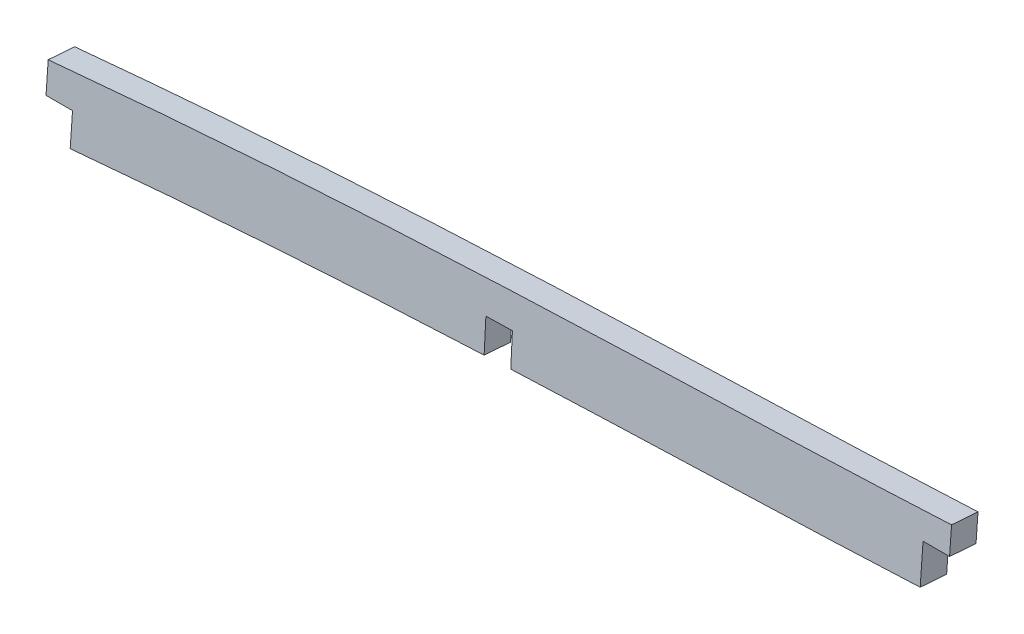
ISO-10303-21;
HEADER;
FILE_DESCRIPTION(('STEP AP214'),'2;1');
FILE_NAME('part.step','',(''),(''),'','','');
FILE_SCHEMA(('AUTOMOTIVE_DESIGN { 1 0 10303 214 1 1 1 1 }'));
ENDSEC;
DATA;
#1=APPLICATION_CONTEXT('core data for automotive mechanical design processes');
#2=APPLICATION_PROTOCOL_DEFINITION('international standard','automotive_design',2000,#1);
#3=PRODUCT_CONTEXT('',#1,'mechanical');
#4=PRODUCT('Part','Part','',(#3));
#5=PRODUCT_RELATED_PRODUCT_CATEGORY('part','',(#4));
#6=PRODUCT_DEFINITION_FORMATION('','',#4);
#7=PRODUCT_DEFINITION_CONTEXT('part definition',#1,'design');
#8=PRODUCT_DEFINITION('design','',#6,#7);
#9=PRODUCT_DEFINITION_SHAPE('','',#8);
#10=(LENGTH_UNIT() NAMED_UNIT(*) SI_UNIT(.MILLI.,.METRE.));
#11=(NAMED_UNIT(*) PLANE_ANGLE_UNIT() SI_UNIT($,.RADIAN.));
#12=(NAMED_UNIT(*) SI_UNIT($,.STERADIAN.) SOLID_ANGLE_UNIT());
#13=UNCERTAINTY_MEASURE_WITH_UNIT(LENGTH_MEASURE(1.E-05),#10,'distance_accuracy_value','');
#14=(GEOMETRIC_REPRESENTATION_CONTEXT(3) GLOBAL_UNCERTAINTY_ASSIGNED_CONTEXT((#13)) GLOBAL_UNIT_ASSIGNED_CONTEXT((#10,
#11,#12)) REPRESENTATION_CONTEXT('',''));
#15=CARTESIAN_POINT('',(0.,0.,0.));
#16=DIRECTION('',(0.,0.,1.));
#17=DIRECTION('',(1.,0.,0.));
#18=AXIS2_PLACEMENT_3D('',#15,#16,#17);
#19=CARTESIAN_POINT('',(267.381419678439,55.3505429301001,-414.969986035978));
#20=CARTESIAN_POINT('',(276.266785963751,56.1449921604025,-415.028990629957));
#21=CARTESIAN_POINT('',(294.055430197414,57.505145214769,-415.130010651954));
#22=CARTESIAN_POINT('',(320.802569684627,58.859506618774,-415.230600521886));
#23=CARTESIAN_POINT('',(343.188421351292,59.5830465900964,-415.284338609364));
#24=CARTESIAN_POINT('',(361.20065040251,60.1721262466564,-415.328090185463));
#25=CARTESIAN_POINT('',(370.250673033949,60.5520193136477,-415.356305249835));
#26=CARTESIAN_POINT('',(374.768324065404,60.7720389265057,-415.372646341787));
#27=B_SPLINE_CURVE_WITH_KNOTS('',3,(#19,#20,#21,#22,#23,#24,#25,#26),.UNSPECIFIED.,.F.,.F.,(4,1,
1,1,1,4),(0.,0.25,0.5,0.75,0.875,1.),.UNSPECIFIED.);
#28=DIRECTION('',(0.,0.0740670663478944,0.997253262558021));
#29=VECTOR('',#28,1.);
#30=SURFACE_OF_LINEAR_EXTRUSION('',#27,#29);
#31=DIRECTION('',(0.,0.0740670663478944,0.997253262558021));
#32=VECTOR('',#31,1.);
#33=CARTESIAN_POINT('',(319.180386609188,58.8622179418261,-413.163303569819));
#34=LINE('',#33,#32);
#35=CARTESIAN_POINT('',(319.180386609188,58.9446679594898,-412.053180634385));
#36=VERTEX_POINT('',#35);
#37=CARTESIAN_POINT('',(319.180386609187,58.7095050238392,-415.219459742954));
#38=VERTEX_POINT('',#37);
#39=EDGE_CURVE('E267',#36,#38,#34,.F.);
#40=ORIENTED_EDGE('',*,*,#39,.F.);
#41=CARTESIAN_POINT('',(267.381419678439,55.5857058657546,-411.803706927357));
#42=CARTESIAN_POINT('',(276.266785963751,56.380155096057,-411.862711521335));
#43=CARTESIAN_POINT('',(294.055430197414,57.7403081504236,-411.963731543333));
#44=CARTESIAN_POINT('',(320.802569684627,59.0946695544286,-412.064321413264));
#45=CARTESIAN_POINT('',(343.188421351292,59.818209525751,-412.118059500743));
#46=CARTESIAN_POINT('',(361.20065040251,60.407289182311,-412.161811076841));
#47=CARTESIAN_POINT('',(370.250673033949,60.7871822493023,-412.190026141213));
#48=CARTESIAN_POINT('',(374.768324065404,61.0072018621602,-412.206367233166));
#49=B_SPLINE_CURVE_WITH_KNOTS('',3,(#41,#42,#43,#44,#45,#46,#47,#48),.UNSPECIFIED.,.F.,.F.,(4,1,
1,1,1,4),(0.,0.25,0.5,0.75,0.875,1.),.UNSPECIFIED.);
#50=CARTESIAN_POINT('',(269.875,55.8056361810018,-411.82004138708));
#51=VERTEX_POINT('',#50);
#52=EDGE_CURVE('E160',#51,#36,#49,.T.);
#53=ORIENTED_EDGE('',*,*,#52,.F.);
#54=DIRECTION('',(0.,0.0740670663478944,0.997253262558021));
#55=VECTOR('',#54,1.);
#56=CARTESIAN_POINT('',(269.875,55.5704732453472,-414.986320495702));
#57=LINE('',#56,#55);
#58=CARTESIAN_POINT('',(269.875,55.5704732453472,-414.986320495702));
#59=VERTEX_POINT('',#58);
#60=EDGE_CURVE('E174',#59,#51,#57,.T.);
#61=ORIENTED_EDGE('',*,*,#60,.F.);
#62=EDGE_CURVE('E142',#59,#38,#27,.T.);
#63=ORIENTED_EDGE('',*,*,#62,.T.);
#64=EDGE_LOOP('',(#40,#53,#61,#63));
#65=FACE_BOUND('',#64,.T.);
#66=ADVANCED_FACE('F33',(#65),#30,.T.);
#67=CARTESIAN_POINT('',(374.396000000001,68.3733100676446,-415.937200878811));
#68=CARTESIAN_POINT('',(369.906968565399,68.1546047890361,-415.920957403869));
#69=CARTESIAN_POINT('',(365.416811664589,67.9659702223396,-415.90694731286));
#70=CARTESIAN_POINT('',(356.434934477744,67.6304723178948,-415.882029524691));
#71=CARTESIAN_POINT('',(351.943241867214,67.4828695335936,-415.871066908043));
#72=CARTESIAN_POINT('',(342.959728051043,67.191099826946,-415.84939685989));
#73=CARTESIAN_POINT('',(338.46791231829,67.0467866775179,-415.838678567943));
#74=CARTESIAN_POINT('',(329.485142554435,66.7351370467292,-415.815532016562));
#75=CARTESIAN_POINT('',(324.994172696955,66.5678564838284,-415.803107910253));
#76=CARTESIAN_POINT('',(311.523515084952,66.008070181035,-415.761531982867));
#77=CARTESIAN_POINT('',(302.548294735156,65.5543942384513,-415.727836985416));
#78=CARTESIAN_POINT('',(284.612946057081,64.4142579684823,-415.643157845298));
#79=CARTESIAN_POINT('',(275.652726317957,63.7292075925199,-415.592278421231));
#80=CARTESIAN_POINT('',(266.7,62.9285761835817,-415.532814670234));
#81=B_SPLINE_CURVE_WITH_KNOTS('',3,(#67,#68,#69,#70,#71,#72,#73,#74,#75,#76,#77,#78,#79,#80),
.UNSPECIFIED.,.F.,.F.,(4,2,2,2,2,2,4),(0.,0.125,0.25,0.375,0.5,0.75,1.),.UNSPECIFIED.);
#82=DIRECTION('',(0.,0.0740670663478944,0.997253262558021));
#83=VECTOR('',#82,1.);
#84=SURFACE_OF_LINEAR_EXTRUSION('',#81,#83);
#85=CARTESIAN_POINT('',(266.7,63.1637391192362,-412.366535561612));
#86=CARTESIAN_POINT('',(275.652726317957,63.9643705281745,-412.425999312609));
#87=CARTESIAN_POINT('',(284.612946057081,64.6494209041368,-412.476878736676));
#88=CARTESIAN_POINT('',(302.548294735156,65.7895571741059,-412.561557876794));
#89=CARTESIAN_POINT('',(311.523515084952,66.2432331166896,-412.595252874245));
#90=CARTESIAN_POINT('',(324.994172696955,66.8030194194829,-412.636828801632));
#91=CARTESIAN_POINT('',(329.485142554435,66.9702999823837,-412.649252907941));
#92=CARTESIAN_POINT('',(338.46791231829,67.2819496131725,-412.672399459321));
#93=CARTESIAN_POINT('',(342.959728051043,67.4262627626006,-412.683117751268));
#94=CARTESIAN_POINT('',(351.943241867214,67.7180324692482,-412.704787799421));
#95=CARTESIAN_POINT('',(356.434934477744,67.8656352535493,-412.715750416069));
#96=CARTESIAN_POINT('',(365.416811664589,68.2011331579942,-412.740668204239));
#97=CARTESIAN_POINT('',(369.906968565399,68.3897677246907,-412.754678295247));
#98=CARTESIAN_POINT('',(374.396000000001,68.6084730032992,-412.770921770189));
#99=B_SPLINE_CURVE_WITH_KNOTS('',3,(#85,#86,#87,#88,#89,#90,#91,#92,#93,#94,#95,#96,#97,#98),
.UNSPECIFIED.,.F.,.F.,(4,2,2,2,2,2,4),(0.,0.25,0.5,0.625,0.75,0.875,1.),.UNSPECIFIED.);
#100=CARTESIAN_POINT('',(374.396000000001,68.6084730032992,-412.770921770189));
#101=VERTEX_POINT('',#100);
#102=CARTESIAN_POINT('',(266.7,63.1637391192362,-412.366535561612));
#103=VERTEX_POINT('',#102);
#104=EDGE_CURVE('E228',#101,#103,#99,.F.);
#105=ORIENTED_EDGE('',*,*,#104,.F.);
#106=DIRECTION('',(0.,0.0740670663478944,0.997253262558021));
#107=VECTOR('',#106,1.);
#108=CARTESIAN_POINT('',(374.396000000001,68.3733100676446,-415.937200878811));
#109=LINE('',#108,#107);
#110=CARTESIAN_POINT('',(374.396000000001,68.3733100676446,-415.937200878811));
#111=VERTEX_POINT('',#110);
#112=EDGE_CURVE('E59',#111,#101,#109,.T.);
#113=ORIENTED_EDGE('',*,*,#112,.F.);
#114=CARTESIAN_POINT('',(374.396000000001,68.3733100676446,-415.937200878811));
#115=CARTESIAN_POINT('',(369.906968565399,68.1546047890361,-415.920957403869));
#116=CARTESIAN_POINT('',(365.416811664589,67.9659702223396,-415.90694731286));
#117=CARTESIAN_POINT('',(356.434934477744,67.6304723178948,-415.882029524691));
#118=CARTESIAN_POINT('',(351.943241867214,67.4828695335936,-415.871066908043));
#119=CARTESIAN_POINT('',(342.959728051043,67.191099826946,-415.84939685989));
#120=CARTESIAN_POINT('',(338.46791231829,67.0467866775179,-415.838678567943));
#121=CARTESIAN_POINT('',(329.485142554435,66.7351370467292,-415.815532016562));
#122=CARTESIAN_POINT('',(324.994172696955,66.5678564838284,-415.803107910253));
#123=CARTESIAN_POINT('',(311.523515084952,66.008070181035,-415.761531982867));
#124=CARTESIAN_POINT('',(302.548294735156,65.5543942384513,-415.727836985416));
#125=CARTESIAN_POINT('',(284.612946057081,64.4142579684823,-415.643157845298));
#126=CARTESIAN_POINT('',(275.652726317957,63.7292075925199,-415.592278421231));
#127=CARTESIAN_POINT('',(266.7,62.9285761835817,-415.532814670234));
#128=B_SPLINE_CURVE_WITH_KNOTS('',3,(#114,#115,#116,#117,#118,#119,#120,#121,#122,#123,#124,
#125,#126,#127),.UNSPECIFIED.,.F.,.F.,(4,2,2,2,2,2,4),(0.,0.125,0.25,0.375,0.5,0.75,1.),.UNSPECIFIED.);
#129=CARTESIAN_POINT('',(266.7,62.9285761835817,-415.532814670234));
#130=VERTEX_POINT('',#129);
#131=EDGE_CURVE('E181',#111,#130,#128,.T.);
#132=ORIENTED_EDGE('',*,*,#131,.T.);
#133=DIRECTION('',(0.,0.0740670663478944,0.997253262558021));
#134=VECTOR('',#133,1.);
#135=CARTESIAN_POINT('',(266.7,62.9285761835817,-415.532814670234));
#136=LINE('',#135,#134);
#137=EDGE_CURVE('E98',#130,#103,#136,.T.);
#138=ORIENTED_EDGE('',*,*,#137,.T.);
#139=EDGE_LOOP('',(#105,#113,#132,#138));
#140=FACE_BOUND('',#139,.T.);
#141=ADVANCED_FACE('F35',(#140),#84,.T.);
#142=CARTESIAN_POINT('',(374.396000000001,65.2070487620994,-415.70203926541));
#143=DIRECTION('',(1.,0.,0.));
#144=DIRECTION('',(0.,0.,-1.));
#145=AXIS2_PLACEMENT_3D('',#142,#143,#144);
#146=PLANE('',#145);
#147=DIRECTION('',(0.,0.997253262558021,-0.0740670663478956));
#148=VECTOR('',#147,1.);
#149=CARTESIAN_POINT('',(374.396000000001,65.442211697754,-412.535760156788));
#150=LINE('',#149,#148);
#151=CARTESIAN_POINT('',(374.396000000001,65.442211697754,-412.535760156788));
#152=VERTEX_POINT('',#151);
#153=EDGE_CURVE('E171',#152,#101,#150,.T.);
#154=ORIENTED_EDGE('',*,*,#153,.F.);
#155=DIRECTION('',(0.,0.0740670663478944,0.997253262558021));
#156=VECTOR('',#155,1.);
#157=CARTESIAN_POINT('',(374.396000000001,65.2070487620994,-415.70203926541));
#158=LINE('',#157,#156);
#159=CARTESIAN_POINT('',(374.396000000001,65.2070487620994,-415.70203926541));
#160=VERTEX_POINT('',#159);
#161=EDGE_CURVE('E128',#160,#152,#158,.T.);
#162=ORIENTED_EDGE('',*,*,#161,.F.);
#163=DIRECTION('',(0.,0.997253262558021,-0.0740670663478956));
#164=VECTOR('',#163,1.);
#165=CARTESIAN_POINT('',(374.396000000001,65.2070487620994,-415.70203926541));
#166=LINE('',#165,#164);
#167=EDGE_CURVE('E137',#160,#111,#166,.T.);
#168=ORIENTED_EDGE('',*,*,#167,.T.);
#169=ORIENTED_EDGE('',*,*,#112,.T.);
#170=EDGE_LOOP('',(#154,#162,#168,#169));
#171=FACE_BOUND('',#170,.T.);
#172=ADVANCED_FACE('F213',(#171),#146,.T.);
#173=CARTESIAN_POINT('',(371.221000000001,65.2070487620994,-415.70203926541));
#174=DIRECTION('',(0.,-0.997253262558021,0.0740670663478944));
#175=DIRECTION('',(0.,-0.0740670663478944,-0.997253262558021));
#176=AXIS2_PLACEMENT_3D('',#173,#174,#175);
#177=PLANE('',#176);
#178=DIRECTION('',(1.,0.,0.));
#179=VECTOR('',#178,1.);
#180=CARTESIAN_POINT('',(371.221000000001,65.442211697754,-412.535760156788));
#181=LINE('',#180,#179);
#182=CARTESIAN_POINT('',(371.221000000001,65.442211697754,-412.535760156788));
#183=VERTEX_POINT('',#182);
#184=EDGE_CURVE('E123',#183,#152,#181,.T.);
#185=ORIENTED_EDGE('',*,*,#184,.F.);
#186=DIRECTION('',(0.,0.0740670663478944,0.997253262558021));
#187=VECTOR('',#186,1.);
#188=CARTESIAN_POINT('',(371.221000000001,65.2070487620994,-415.70203926541));
#189=LINE('',#188,#187);
#190=CARTESIAN_POINT('',(371.221000000001,65.2070487620994,-415.70203926541));
#191=VERTEX_POINT('',#190);
#192=EDGE_CURVE('E117',#191,#183,#189,.T.);
#193=ORIENTED_EDGE('',*,*,#192,.F.);
#194=DIRECTION('',(1.,0.,0.));
#195=VECTOR('',#194,1.);
#196=CARTESIAN_POINT('',(371.221000000001,65.2070487620994,-415.70203926541));
#197=LINE('',#196,#195);
#198=EDGE_CURVE('E120',#191,#160,#197,.T.);
#199=ORIENTED_EDGE('',*,*,#198,.T.);
#200=ORIENTED_EDGE('',*,*,#161,.T.);
#201=EDGE_LOOP('',(#185,#193,#199,#200));
#202=FACE_BOUND('',#201,.T.);
#203=ADVANCED_FACE('F119',(#202),#177,.T.);
#204=CARTESIAN_POINT('',(371.221000000001,65.2070487620994,-415.70203926541));
#205=DIRECTION('',(1.,0.,0.));
#206=DIRECTION('',(0.,1.,0.));
#207=AXIS2_PLACEMENT_3D('',#204,#205,#206);
#208=PLANE('',#207);
#209=DIRECTION('',(0.,0.997253262558021,-0.0740670663478947));
#210=VECTOR('',#209,1.);
#211=CARTESIAN_POINT('',(371.221000000001,65.442211697754,-412.535760156788));
#212=LINE('',#211,#210);
#213=CARTESIAN_POINT('',(371.221000000001,60.8405169930736,-412.193987369673));
#214=VERTEX_POINT('',#213);
#215=EDGE_CURVE('E165',#214,#183,#212,.T.);
#216=ORIENTED_EDGE('',*,*,#215,.F.);
#217=DIRECTION('',(0.,0.0740670663478944,0.997253262558021));
#218=VECTOR('',#217,1.);
#219=CARTESIAN_POINT('',(371.221000000001,60.605354057419,-415.360266478295));
#220=LINE('',#219,#218);
#221=CARTESIAN_POINT('',(371.221000000001,60.605354057419,-415.360266478295));
#222=VERTEX_POINT('',#221);
#223=EDGE_CURVE('E129',#222,#214,#220,.T.);
#224=ORIENTED_EDGE('',*,*,#223,.F.);
#225=DIRECTION('',(0.,0.997253262558021,-0.0740670663478947));
#226=VECTOR('',#225,1.);
#227=CARTESIAN_POINT('',(371.221000000001,65.2070487620994,-415.70203926541));
#228=LINE('',#227,#226);
#229=EDGE_CURVE('E136',#222,#191,#228,.T.);
#230=ORIENTED_EDGE('',*,*,#229,.T.);
#231=ORIENTED_EDGE('',*,*,#192,.T.);
#232=EDGE_LOOP('',(#216,#224,#230,#231));
#233=FACE_BOUND('',#232,.T.);
#234=ADVANCED_FACE('F140',(#233),#208,.T.);
#235=DIRECTION('',(0.,0.0740670663478944,0.997253262558021));
#236=VECTOR('',#235,1.);
#237=CARTESIAN_POINT('',(322.353349484499,58.9939078626532,-413.173084321078));
#238=LINE('',#237,#236);
#239=CARTESIAN_POINT('',(322.353349484499,59.0763578803169,-412.062961385644));
#240=VERTEX_POINT('',#239);
#241=CARTESIAN_POINT('',(322.353349484499,58.8411949446663,-415.229240494213));
#242=VERTEX_POINT('',#241);
#243=EDGE_CURVE('E50',#240,#242,#238,.F.);
#244=ORIENTED_EDGE('',*,*,#243,.T.);
#245=EDGE_CURVE('E145',#242,#222,#27,.T.);
#246=ORIENTED_EDGE('',*,*,#245,.T.);
#247=ORIENTED_EDGE('',*,*,#223,.T.);
#248=EDGE_CURVE('E159',#240,#214,#49,.T.);
#249=ORIENTED_EDGE('',*,*,#248,.F.);
#250=EDGE_LOOP('',(#244,#246,#247,#249));
#251=FACE_BOUND('',#250,.T.);
#252=ADVANCED_FACE('F292',(#251),#30,.T.);
#253=CARTESIAN_POINT('',(269.875,59.3700081756932,-415.268516018487));
#254=DIRECTION('',(-1.,0.,0.));
#255=DIRECTION('',(0.,-1.,0.));
#256=AXIS2_PLACEMENT_3D('',#253,#254,#255);
#257=PLANE('',#256);
#258=DIRECTION('',(0.,-0.997253262558021,0.0740670663478924));
#259=VECTOR('',#258,1.);
#260=CARTESIAN_POINT('',(269.875,59.6051711113478,-412.102236909865));
#261=LINE('',#260,#259);
#262=CARTESIAN_POINT('',(269.875,59.6051711113478,-412.102236909865));
#263=VERTEX_POINT('',#262);
#264=EDGE_CURVE('E155',#263,#51,#261,.T.);
#265=ORIENTED_EDGE('',*,*,#264,.F.);
#266=DIRECTION('',(0.,0.0740670663478944,0.997253262558021));
#267=VECTOR('',#266,1.);
#268=CARTESIAN_POINT('',(269.875,59.3700081756932,-415.268516018487));
#269=LINE('',#268,#267);
#270=CARTESIAN_POINT('',(269.875,59.3700081756932,-415.268516018487));
#271=VERTEX_POINT('',#270);
#272=EDGE_CURVE('E176',#271,#263,#269,.T.);
#273=ORIENTED_EDGE('',*,*,#272,.F.);
#274=DIRECTION('',(0.,-0.997253262558021,0.0740670663478924));
#275=VECTOR('',#274,1.);
#276=CARTESIAN_POINT('',(269.875,59.3700081756932,-415.268516018487));
#277=LINE('',#276,#275);
#278=EDGE_CURVE('E286',#271,#59,#277,.T.);
#279=ORIENTED_EDGE('',*,*,#278,.T.);
#280=ORIENTED_EDGE('',*,*,#60,.T.);
#281=EDGE_LOOP('',(#265,#273,#279,#280));
#282=FACE_BOUND('',#281,.T.);
#283=ADVANCED_FACE('F317',(#282),#257,.T.);
#284=CARTESIAN_POINT('',(266.7,59.3700081756932,-415.268516018487));
#285=DIRECTION('',(0.,-0.997253262558021,0.0740670663478944));
#286=DIRECTION('',(0.,-0.0740670663478944,-0.997253262558021));
#287=AXIS2_PLACEMENT_3D('',#284,#285,#286);
#288=PLANE('',#287);
#289=DIRECTION('',(1.,0.,0.));
#290=VECTOR('',#289,1.);
#291=CARTESIAN_POINT('',(266.7,59.6051711113478,-412.102236909865));
#292=LINE('',#291,#290);
#293=CARTESIAN_POINT('',(266.7,59.6051711113478,-412.102236909865));
#294=VERTEX_POINT('',#293);
#295=EDGE_CURVE('E152',#294,#263,#292,.T.);
#296=ORIENTED_EDGE('',*,*,#295,.F.);
#297=DIRECTION('',(0.,0.0740670663478944,0.997253262558021));
#298=VECTOR('',#297,1.);
#299=CARTESIAN_POINT('',(266.7,59.3700081756932,-415.268516018487));
#300=LINE('',#299,#298);
#301=CARTESIAN_POINT('',(266.7,59.3700081756932,-415.268516018487));
#302=VERTEX_POINT('',#301);
#303=EDGE_CURVE('E178',#302,#294,#300,.T.);
#304=ORIENTED_EDGE('',*,*,#303,.F.);
#305=DIRECTION('',(1.,0.,0.));
#306=VECTOR('',#305,1.);
#307=CARTESIAN_POINT('',(266.7,59.3700081756932,-415.268516018487));
#308=LINE('',#307,#306);
#309=EDGE_CURVE('E281',#302,#271,#308,.T.);
#310=ORIENTED_EDGE('',*,*,#309,.T.);
#311=ORIENTED_EDGE('',*,*,#272,.T.);
#312=EDGE_LOOP('',(#296,#304,#310,#311));
#313=FACE_BOUND('',#312,.T.);
#314=ADVANCED_FACE('F316',(#313),#288,.T.);
#315=CARTESIAN_POINT('',(266.7,62.9285761835817,-415.532814670234));
#316=DIRECTION('',(-1.,0.,0.));
#317=DIRECTION('',(0.,-1.,0.));
#318=AXIS2_PLACEMENT_3D('',#315,#316,#317);
#319=PLANE('',#318);
#320=DIRECTION('',(0.,-0.997253262558021,0.0740670663478917));
#321=VECTOR('',#320,1.);
#322=CARTESIAN_POINT('',(266.7,63.1637391192362,-412.366535561612));
#323=LINE('',#322,#321);
#324=EDGE_CURVE('E156',#103,#294,#323,.T.);
#325=ORIENTED_EDGE('',*,*,#324,.F.);
#326=ORIENTED_EDGE('',*,*,#137,.F.);
#327=DIRECTION('',(0.,-0.997253262558021,0.0740670663478917));
#328=VECTOR('',#327,1.);
#329=CARTESIAN_POINT('',(266.7,62.9285761835817,-415.532814670234));
#330=LINE('',#329,#328);
#331=EDGE_CURVE('E287',#130,#302,#330,.T.);
#332=ORIENTED_EDGE('',*,*,#331,.T.);
#333=ORIENTED_EDGE('',*,*,#303,.T.);
#334=EDGE_LOOP('',(#325,#326,#332,#333));
#335=FACE_BOUND('',#334,.T.);
#336=ADVANCED_FACE('F206',(#335),#319,.T.);
#337=CARTESIAN_POINT('',(320.503953492954,66.3812610495639,-415.789249267791));
#338=DIRECTION('',(0.,0.0740670663479247,0.997253262558018));
#339=DIRECTION('',(0.,-0.997253262558018,0.0740670663479247));
#340=AXIS2_PLACEMENT_3D('',#337,#338,#339);
#341=PLANE('',#340);
#342=DIRECTION('',(0.999787874769594,0.0205396762896743,-0.00152550372475393));
#343=VECTOR('',#342,1.);
#344=CARTESIAN_POINT('',(322.274861127297,62.6407298750125,-415.511436016995));
#345=LINE('',#344,#343);
#346=CARTESIAN_POINT('',(319.100525028198,62.5755162056378,-415.506592528026));
#347=VERTEX_POINT('',#346);
#348=CARTESIAN_POINT('',(322.274861127297,62.6407298750125,-415.511436016995));
#349=VERTEX_POINT('',#348);
#350=EDGE_CURVE('E419',#347,#349,#345,.T.);
#351=ORIENTED_EDGE('',*,*,#350,.F.);
#352=DIRECTION('',(-0.0205962487755898,0.997041719980024,-0.0740513548535765));
#353=VECTOR('',#352,1.);
#354=CARTESIAN_POINT('',(319.100525028198,62.5755162056378,-415.506592528026));
#355=LINE('',#354,#353);
#356=EDGE_CURVE('E266',#38,#347,#355,.T.);
#357=ORIENTED_EDGE('',*,*,#356,.F.);
#358=ORIENTED_EDGE('',*,*,#62,.F.);
#359=ORIENTED_EDGE('',*,*,#278,.F.);
#360=ORIENTED_EDGE('',*,*,#309,.F.);
#361=ORIENTED_EDGE('',*,*,#331,.F.);
#362=ORIENTED_EDGE('',*,*,#131,.F.);
#363=ORIENTED_EDGE('',*,*,#167,.F.);
#364=ORIENTED_EDGE('',*,*,#198,.F.);
#365=ORIENTED_EDGE('',*,*,#229,.F.);
#366=ORIENTED_EDGE('',*,*,#245,.F.);
#367=DIRECTION('',(0.0205962487773723,-0.997041719979988,0.0740513548535614));
#368=VECTOR('',#367,1.);
#369=CARTESIAN_POINT('',(322.274861127297,62.6407298750125,-415.511436016995));
#370=LINE('',#369,#368);
#371=EDGE_CURVE('E297',#349,#242,#370,.T.);
#372=ORIENTED_EDGE('',*,*,#371,.F.);
#373=EDGE_LOOP('',(#351,#357,#358,#359,#360,#361,#362,#363,#364,#365,#366,#372));
#374=FACE_BOUND('',#373,.T.);
#375=ADVANCED_FACE('F134',(#374),#341,.F.);
#376=CARTESIAN_POINT('',(320.503953492954,66.6164239852185,-412.622970159169));
#377=DIRECTION('',(0.,0.0740670663479247,0.997253262558018));
#378=DIRECTION('',(0.,-0.997253262558018,0.0740670663479247));
#379=AXIS2_PLACEMENT_3D('',#376,#377,#378);
#380=PLANE('',#379);
#381=DIRECTION('',(0.0205962487755898,-0.997041719979962,0.0740513548544129));
#382=VECTOR('',#381,1.);
#383=CARTESIAN_POINT('',(319.022537082218,66.5859897158179,-412.620709773432));
#384=LINE('',#383,#382);
#385=CARTESIAN_POINT('',(319.100525028199,62.8106791412856,-412.34031341946));
#386=VERTEX_POINT('',#385);
#387=EDGE_CURVE('E11',#386,#36,#384,.T.);
#388=ORIENTED_EDGE('',*,*,#387,.F.);
#389=DIRECTION('',(-0.999787874769594,-0.0205396762896776,0.00152550372470976));
#390=VECTOR('',#389,1.);
#391=CARTESIAN_POINT('',(320.581941438942,62.8411134106889,-412.342573805198));
#392=LINE('',#391,#390);
#393=CARTESIAN_POINT('',(322.274861127297,62.8758928106603,-412.345156908429));
#394=VERTEX_POINT('',#393);
#395=EDGE_CURVE('E43',#394,#386,#392,.T.);
#396=ORIENTED_EDGE('',*,*,#395,.F.);
#397=DIRECTION('',(-0.0205962487773723,0.997041719979925,-0.0740513548544101));
#398=VECTOR('',#397,1.);
#399=CARTESIAN_POINT('',(322.19687318131,66.65120338519,-412.625553262401));
#400=LINE('',#399,#398);
#401=EDGE_CURVE('E245',#240,#394,#400,.T.);
#402=ORIENTED_EDGE('',*,*,#401,.F.);
#403=ORIENTED_EDGE('',*,*,#248,.T.);
#404=ORIENTED_EDGE('',*,*,#215,.T.);
#405=ORIENTED_EDGE('',*,*,#184,.T.);
#406=ORIENTED_EDGE('',*,*,#153,.T.);
#407=ORIENTED_EDGE('',*,*,#104,.T.);
#408=ORIENTED_EDGE('',*,*,#324,.T.);
#409=ORIENTED_EDGE('',*,*,#295,.T.);
#410=ORIENTED_EDGE('',*,*,#264,.T.);
#411=ORIENTED_EDGE('',*,*,#52,.T.);
#412=EDGE_LOOP('',(#388,#396,#402,#403,#404,#405,#406,#407,#408,#409,#410,#411));
#413=FACE_BOUND('',#412,.T.);
#414=ADVANCED_FACE('F205',(#413),#380,.T.);
#415=CARTESIAN_POINT('',(322.274861127297,62.946155710983,-411.399123670725));
#416=DIRECTION('',(-0.0205962487773586,0.997041719979988,-0.0740513548535667));
#417=DIRECTION('',(0.,0.074067066347081,0.997253262558081));
#418=AXIS2_PLACEMENT_3D('',#415,#416,#417);
#419=PLANE('',#418);
#420=ORIENTED_EDGE('',*,*,#395,.T.);
#421=DIRECTION('',(0.,-0.0740670663470824,-0.997253262558081));
#422=VECTOR('',#421,1.);
#423=CARTESIAN_POINT('',(319.100525028199,62.8809420416083,-411.394280181756));
#424=LINE('',#423,#422);
#425=EDGE_CURVE('E254',#386,#347,#424,.T.);
#426=ORIENTED_EDGE('',*,*,#425,.T.);
#427=ORIENTED_EDGE('',*,*,#350,.T.);
#428=DIRECTION('',(0.,-0.0740670663470824,-0.997253262558081));
#429=VECTOR('',#428,1.);
#430=CARTESIAN_POINT('',(322.274861127297,62.946155710983,-411.399123670725));
#431=LINE('',#430,#429);
#432=EDGE_CURVE('E258',#394,#349,#431,.T.);
#433=ORIENTED_EDGE('',*,*,#432,.F.);
#434=EDGE_LOOP('',(#420,#426,#427,#433));
#435=FACE_BOUND('',#434,.T.);
#436=ADVANCED_FACE('F207',(#435),#419,.F.);
#437=CARTESIAN_POINT('',(319.100525028199,62.8809420416083,-411.394280181756));
#438=DIRECTION('',(-0.99978787476963,-0.0205396762879097,0.00152550372463072));
#439=DIRECTION('',(0.0205397001875245,-0.999789038105643,0.));
#440=AXIS2_PLACEMENT_3D('',#437,#438,#439);
#441=PLANE('',#440);
#442=ORIENTED_EDGE('',*,*,#387,.T.);
#443=ORIENTED_EDGE('',*,*,#39,.T.);
#444=ORIENTED_EDGE('',*,*,#356,.T.);
#445=ORIENTED_EDGE('',*,*,#425,.F.);
#446=EDGE_LOOP('',(#442,#443,#444,#445));
#447=FACE_BOUND('',#446,.T.);
#448=ADVANCED_FACE('F262',(#447),#441,.F.);
#449=CARTESIAN_POINT('',(322.274861127297,62.946155710983,-411.399123670725));
#450=DIRECTION('',(0.999787874769593,0.0205396762896873,-0.00152550372476275));
#451=DIRECTION('',(-0.0205397001893022,0.999789038105606,0.));
#452=AXIS2_PLACEMENT_3D('',#449,#450,#451);
#453=PLANE('',#452);
#454=ORIENTED_EDGE('',*,*,#401,.T.);
#455=ORIENTED_EDGE('',*,*,#432,.T.);
#456=ORIENTED_EDGE('',*,*,#371,.T.);
#457=ORIENTED_EDGE('',*,*,#243,.F.);
#458=EDGE_LOOP('',(#454,#455,#456,#457));
#459=FACE_BOUND('',#458,.T.);
#460=ADVANCED_FACE('F303',(#459),#453,.F.);
#461=CLOSED_SHELL('',(#66,#141,#172,#203,#234,#252,#283,#314,#336,#375,#414,#436,#448,#460));
#462=MANIFOLD_SOLID_BREP('B2',#461);
#463=ADVANCED_BREP_SHAPE_REPRESENTATION('',(#18,#462),#14);
#464=SHAPE_DEFINITION_REPRESENTATION(#9,#463);
ENDSEC;
END-ISO-10303-21;
